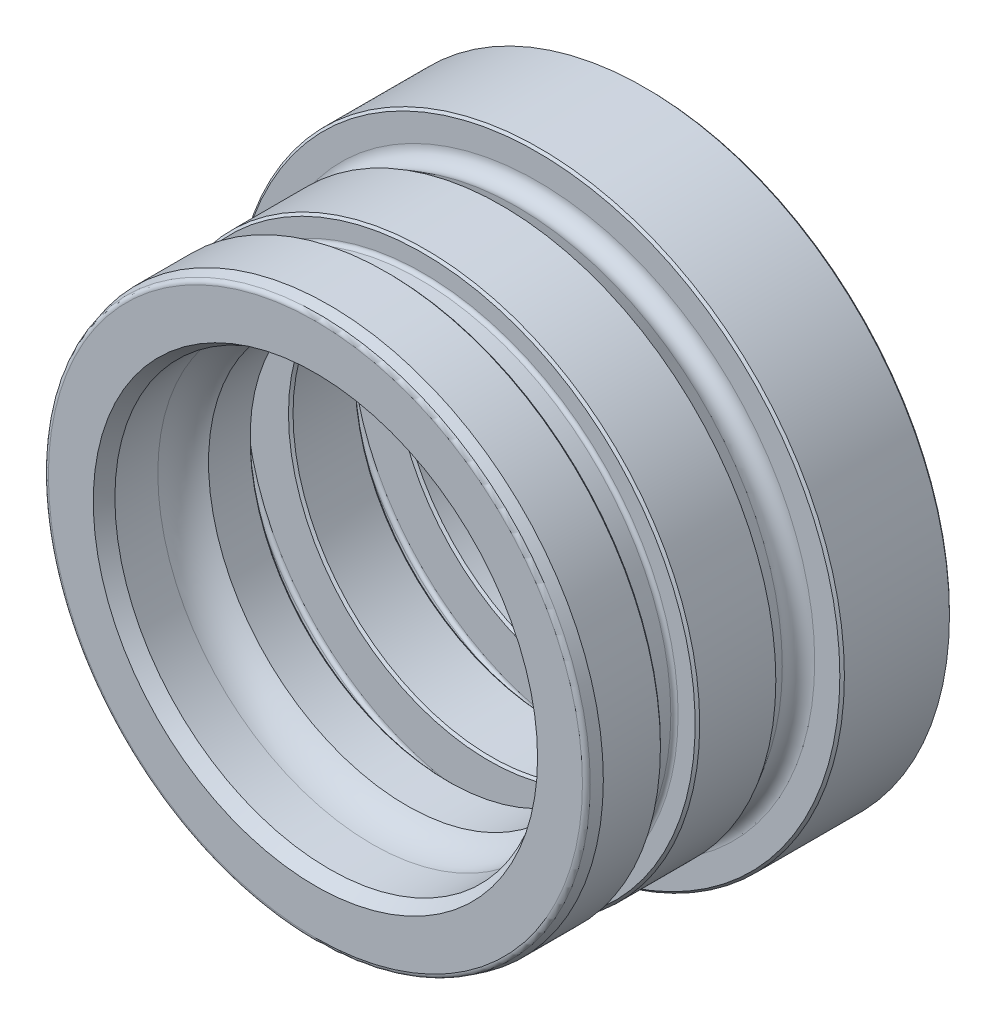
ISO-10303-21;
HEADER;
FILE_DESCRIPTION(('STEP AP214'),'2;1');
FILE_NAME('part.step','',(''),(''),'','','');
FILE_SCHEMA(('AUTOMOTIVE_DESIGN { 1 0 10303 214 1 1 1 1 }'));
ENDSEC;
DATA;
#1=APPLICATION_CONTEXT('core data for automotive mechanical design processes');
#2=APPLICATION_PROTOCOL_DEFINITION('international standard','automotive_design',2000,#1);
#3=PRODUCT_CONTEXT('',#1,'mechanical');
#4=PRODUCT('Part','Part','',(#3));
#5=PRODUCT_RELATED_PRODUCT_CATEGORY('part','',(#4));
#6=PRODUCT_DEFINITION_FORMATION('','',#4);
#7=PRODUCT_DEFINITION_CONTEXT('part definition',#1,'design');
#8=PRODUCT_DEFINITION('design','',#6,#7);
#9=PRODUCT_DEFINITION_SHAPE('','',#8);
#10=(LENGTH_UNIT() NAMED_UNIT(*) SI_UNIT(.MILLI.,.METRE.));
#11=(NAMED_UNIT(*) PLANE_ANGLE_UNIT() SI_UNIT($,.RADIAN.));
#12=(NAMED_UNIT(*) SI_UNIT($,.STERADIAN.) SOLID_ANGLE_UNIT());
#13=UNCERTAINTY_MEASURE_WITH_UNIT(LENGTH_MEASURE(1.E-05),#10,'distance_accuracy_value','');
#14=(GEOMETRIC_REPRESENTATION_CONTEXT(3) GLOBAL_UNCERTAINTY_ASSIGNED_CONTEXT((#13)) GLOBAL_UNIT_ASSIGNED_CONTEXT((#10,
#11,#12)) REPRESENTATION_CONTEXT('',''));
#15=CARTESIAN_POINT('',(0.,0.,0.));
#16=DIRECTION('',(0.,0.,1.));
#17=DIRECTION('',(1.,0.,0.));
#18=AXIS2_PLACEMENT_3D('',#15,#16,#17);
#19=CARTESIAN_POINT('',(0.,0.,-22.8));
#20=DIRECTION('',(0.,0.,1.));
#21=DIRECTION('',(1.,0.,0.));
#22=AXIS2_PLACEMENT_3D('',#19,#20,#21);
#23=TOROIDAL_SURFACE('',#22,30.35,1.5);
#24=CARTESIAN_POINT('',(0.,0.,-22.05));
#25=DIRECTION('',(0.,0.,1.));
#26=DIRECTION('',(1.,0.,0.));
#27=AXIS2_PLACEMENT_3D('',#24,#25,#26);
#28=CIRCLE('',#27,29.0509618943233);
#29=CARTESIAN_POINT('',(29.0509618943233,0.,-22.05));
#30=VERTEX_POINT('',#29);
#31=EDGE_CURVE('E107',#30,#30,#28,.T.);
#32=ORIENTED_EDGE('',*,*,#31,.F.);
#33=EDGE_LOOP('',(#32));
#34=FACE_BOUND('',#33,.T.);
#35=CARTESIAN_POINT('',(0.,0.,-24.3));
#36=DIRECTION('',(0.,0.,1.));
#37=DIRECTION('',(1.,0.,0.));
#38=AXIS2_PLACEMENT_3D('',#35,#36,#37);
#39=CIRCLE('',#38,30.35);
#40=CARTESIAN_POINT('',(30.35,0.,-24.3));
#41=VERTEX_POINT('',#40);
#42=EDGE_CURVE('E207',#41,#41,#39,.T.);
#43=ORIENTED_EDGE('',*,*,#42,.T.);
#44=EDGE_LOOP('',(#43));
#45=FACE_BOUND('',#44,.T.);
#46=ADVANCED_FACE('F41',(#34,#45),#23,.F.);
#47=CARTESIAN_POINT('',(0.,0.,-22.05));
#48=DIRECTION('',(0.,0.,1.));
#49=DIRECTION('',(1.,0.,0.));
#50=AXIS2_PLACEMENT_3D('',#47,#48,#49);
#51=CONICAL_SURFACE('',#50,29.0509618943233,0.5235987755983);
#52=CARTESIAN_POINT('',(0.,0.,-20.3802370205356));
#53=DIRECTION('',(0.,0.,1.));
#54=DIRECTION('',(1.,0.,0.));
#55=AXIS2_PLACEMENT_3D('',#52,#53,#54);
#56=CIRCLE('',#55,30.015);
#57=CARTESIAN_POINT('',(30.015,0.,-20.3802370205356));
#58=VERTEX_POINT('',#57);
#59=EDGE_CURVE('E111',#58,#58,#56,.T.);
#60=ORIENTED_EDGE('',*,*,#59,.F.);
#61=EDGE_LOOP('',(#60));
#62=FACE_BOUND('',#61,.T.);
#63=ORIENTED_EDGE('',*,*,#31,.T.);
#64=EDGE_LOOP('',(#63));
#65=FACE_BOUND('',#64,.T.);
#66=ADVANCED_FACE('F231',(#62,#65),#51,.T.);
#67=CARTESIAN_POINT('',(0.,0.,32.9509546686376));
#68=DIRECTION('',(0.,0.,1.));
#69=DIRECTION('',(1.,0.,0.));
#70=AXIS2_PLACEMENT_3D('',#67,#68,#69);
#71=CYLINDRICAL_SURFACE('',#70,30.015);
#72=CARTESIAN_POINT('',(0.,0.,-12.05));
#73=DIRECTION('',(0.,0.,-1.));
#74=DIRECTION('',(-1.,0.,0.));
#75=AXIS2_PLACEMENT_3D('',#72,#73,#74);
#76=CIRCLE('',#75,30.015);
#77=CARTESIAN_POINT('',(-30.015,0.,-12.05));
#78=VERTEX_POINT('',#77);
#79=EDGE_CURVE('E83',#78,#78,#76,.T.);
#80=ORIENTED_EDGE('',*,*,#79,.T.);
#81=EDGE_LOOP('',(#80));
#82=FACE_BOUND('',#81,.T.);
#83=ORIENTED_EDGE('',*,*,#59,.T.);
#84=EDGE_LOOP('',(#83));
#85=FACE_BOUND('',#84,.T.);
#86=ADVANCED_FACE('F237',(#82,#85),#71,.T.);
#87=CARTESIAN_POINT('',(0.,30.015,-11.8));
#88=DIRECTION('',(0.,0.,-1.));
#89=DIRECTION('',(-1.,0.,0.));
#90=AXIS2_PLACEMENT_3D('',#87,#88,#89);
#91=PLANE('',#90);
#92=CARTESIAN_POINT('',(0.,0.,-11.8));
#93=DIRECTION('',(0.,0.,-1.));
#94=DIRECTION('',(-1.,0.,0.));
#95=AXIS2_PLACEMENT_3D('',#92,#93,#94);
#96=CIRCLE('',#95,29.765);
#97=CARTESIAN_POINT('',(-29.765,0.,-11.8));
#98=VERTEX_POINT('',#97);
#99=EDGE_CURVE('E87',#98,#98,#96,.F.);
#100=ORIENTED_EDGE('',*,*,#99,.T.);
#101=EDGE_LOOP('',(#100));
#102=FACE_BOUND('',#101,.T.);
#103=CARTESIAN_POINT('',(0.,0.,-11.8));
#104=DIRECTION('',(0.,0.,1.));
#105=DIRECTION('',(1.,0.,0.));
#106=AXIS2_PLACEMENT_3D('',#103,#104,#105);
#107=CIRCLE('',#106,27.9);
#108=CARTESIAN_POINT('',(27.9,0.,-11.8));
#109=VERTEX_POINT('',#108);
#110=EDGE_CURVE('E115',#109,#109,#107,.T.);
#111=ORIENTED_EDGE('',*,*,#110,.F.);
#112=EDGE_LOOP('',(#111));
#113=FACE_BOUND('',#112,.T.);
#114=ADVANCED_FACE('F359',(#102,#113),#91,.F.);
#115=CARTESIAN_POINT('',(0.,0.,-11.4));
#116=DIRECTION('',(0.,0.,1.));
#117=DIRECTION('',(1.,0.,0.));
#118=AXIS2_PLACEMENT_3D('',#115,#116,#117);
#119=TOROIDAL_SURFACE('',#118,27.9,0.4);
#120=CARTESIAN_POINT('',(0.,0.,-11.4));
#121=DIRECTION('',(0.,0.,1.));
#122=DIRECTION('',(1.,0.,0.));
#123=AXIS2_PLACEMENT_3D('',#120,#121,#122);
#124=CIRCLE('',#123,27.5);
#125=CARTESIAN_POINT('',(27.5,0.,-11.4));
#126=VERTEX_POINT('',#125);
#127=EDGE_CURVE('E119',#126,#126,#124,.T.);
#128=ORIENTED_EDGE('',*,*,#127,.F.);
#129=EDGE_LOOP('',(#128));
#130=FACE_BOUND('',#129,.T.);
#131=ORIENTED_EDGE('',*,*,#110,.T.);
#132=EDGE_LOOP('',(#131));
#133=FACE_BOUND('',#132,.T.);
#134=ADVANCED_FACE('F355',(#130,#133),#119,.F.);
#135=CARTESIAN_POINT('',(0.,0.,32.9509546686376));
#136=DIRECTION('',(0.,0.,1.));
#137=DIRECTION('',(1.,0.,0.));
#138=AXIS2_PLACEMENT_3D('',#135,#136,#137);
#139=CYLINDRICAL_SURFACE('',#138,27.5);
#140=CARTESIAN_POINT('',(0.,0.,-8.4));
#141=DIRECTION('',(0.,0.,1.));
#142=DIRECTION('',(1.,0.,0.));
#143=AXIS2_PLACEMENT_3D('',#140,#141,#142);
#144=CIRCLE('',#143,27.5);
#145=CARTESIAN_POINT('',(27.5,0.,-8.4));
#146=VERTEX_POINT('',#145);
#147=EDGE_CURVE('E123',#146,#146,#144,.T.);
#148=ORIENTED_EDGE('',*,*,#147,.F.);
#149=EDGE_LOOP('',(#148));
#150=FACE_BOUND('',#149,.T.);
#151=ORIENTED_EDGE('',*,*,#127,.T.);
#152=EDGE_LOOP('',(#151));
#153=FACE_BOUND('',#152,.T.);
#154=ADVANCED_FACE('F351',(#150,#153),#139,.T.);
#155=CARTESIAN_POINT('',(0.,0.,-8.4));
#156=DIRECTION('',(0.,0.,1.));
#157=DIRECTION('',(1.,0.,0.));
#158=AXIS2_PLACEMENT_3D('',#155,#156,#157);
#159=TOROIDAL_SURFACE('',#158,27.9,0.4);
#160=CARTESIAN_POINT('',(0.,0.,-8.));
#161=DIRECTION('',(0.,0.,1.));
#162=DIRECTION('',(1.,0.,0.));
#163=AXIS2_PLACEMENT_3D('',#160,#161,#162);
#164=CIRCLE('',#163,27.9);
#165=CARTESIAN_POINT('',(27.9,0.,-8.));
#166=VERTEX_POINT('',#165);
#167=EDGE_CURVE('E127',#166,#166,#164,.T.);
#168=ORIENTED_EDGE('',*,*,#167,.F.);
#169=EDGE_LOOP('',(#168));
#170=FACE_BOUND('',#169,.T.);
#171=ORIENTED_EDGE('',*,*,#147,.T.);
#172=EDGE_LOOP('',(#171));
#173=FACE_BOUND('',#172,.T.);
#174=ADVANCED_FACE('F347',(#170,#173),#159,.F.);
#175=CARTESIAN_POINT('',(0.,27.9,-8.));
#176=DIRECTION('',(0.,0.,1.));
#177=DIRECTION('',(1.,0.,0.));
#178=AXIS2_PLACEMENT_3D('',#175,#176,#177);
#179=PLANE('',#178);
#180=CARTESIAN_POINT('',(0.,0.,-8.));
#181=DIRECTION('',(0.,0.,1.));
#182=DIRECTION('',(1.,0.,0.));
#183=AXIS2_PLACEMENT_3D('',#180,#181,#182);
#184=CIRCLE('',#183,29.765);
#185=CARTESIAN_POINT('',(29.765,0.,-8.));
#186=VERTEX_POINT('',#185);
#187=EDGE_CURVE('E91',#186,#186,#184,.F.);
#188=ORIENTED_EDGE('',*,*,#187,.T.);
#189=EDGE_LOOP('',(#188));
#190=FACE_BOUND('',#189,.T.);
#191=ORIENTED_EDGE('',*,*,#167,.T.);
#192=EDGE_LOOP('',(#191));
#193=FACE_BOUND('',#192,.T.);
#194=ADVANCED_FACE('F343',(#190,#193),#179,.F.);
#195=CARTESIAN_POINT('',(0.,0.,32.9509546686376));
#196=DIRECTION('',(0.,0.,1.));
#197=DIRECTION('',(1.,0.,0.));
#198=AXIS2_PLACEMENT_3D('',#195,#196,#197);
#199=CYLINDRICAL_SURFACE('',#198,30.015);
#200=CARTESIAN_POINT('',(0.,0.,-7.75000000000001));
#201=DIRECTION('',(0.,0.,1.));
#202=DIRECTION('',(1.,0.,0.));
#203=AXIS2_PLACEMENT_3D('',#200,#201,#202);
#204=CIRCLE('',#203,30.015);
#205=CARTESIAN_POINT('',(30.015,0.,-7.75000000000001));
#206=VERTEX_POINT('',#205);
#207=EDGE_CURVE('E95',#206,#206,#204,.T.);
#208=ORIENTED_EDGE('',*,*,#207,.T.);
#209=EDGE_LOOP('',(#208));
#210=FACE_BOUND('',#209,.T.);
#211=CARTESIAN_POINT('',(0.,0.,-1.5));
#212=DIRECTION('',(0.,0.,1.));
#213=DIRECTION('',(1.,0.,0.));
#214=AXIS2_PLACEMENT_3D('',#211,#212,#213);
#215=CIRCLE('',#214,30.015);
#216=CARTESIAN_POINT('',(30.015,0.,-1.5));
#217=VERTEX_POINT('',#216);
#218=EDGE_CURVE('E131',#217,#217,#215,.T.);
#219=ORIENTED_EDGE('',*,*,#218,.F.);
#220=EDGE_LOOP('',(#219));
#221=FACE_BOUND('',#220,.T.);
#222=ADVANCED_FACE('F339',(#210,#221),#199,.T.);
#223=CARTESIAN_POINT('',(0.,0.,-1.5));
#224=DIRECTION('',(0.,0.,-1.));
#225=DIRECTION('',(-1.,0.,0.));
#226=AXIS2_PLACEMENT_3D('',#223,#224,#225);
#227=CONICAL_SURFACE('',#226,30.015,0.261799387799151);
#228=CARTESIAN_POINT('',(0.,0.,-0.370590477448737));
#229=DIRECTION('',(0.,0.,1.));
#230=DIRECTION('',(1.,0.,0.));
#231=AXIS2_PLACEMENT_3D('',#228,#229,#230);
#232=CIRCLE('',#231,29.7123756305084);
#233=CARTESIAN_POINT('',(29.7123756305084,0.,-0.370590477448737));
#234=VERTEX_POINT('',#233);
#235=EDGE_CURVE('E135',#234,#234,#232,.T.);
#236=ORIENTED_EDGE('',*,*,#235,.F.);
#237=EDGE_LOOP('',(#236));
#238=FACE_BOUND('',#237,.T.);
#239=ORIENTED_EDGE('',*,*,#218,.T.);
#240=EDGE_LOOP('',(#239));
#241=FACE_BOUND('',#240,.T.);
#242=ADVANCED_FACE('F335',(#238,#241),#227,.T.);
#243=CARTESIAN_POINT('',(0.,0.,-0.5));
#244=DIRECTION('',(0.,0.,1.));
#245=DIRECTION('',(1.,0.,0.));
#246=AXIS2_PLACEMENT_3D('',#243,#244,#245);
#247=TOROIDAL_SURFACE('',#246,29.2294127173638,0.499999999999999);
#248=CARTESIAN_POINT('',(0.,0.,0.));
#249=DIRECTION('',(0.,0.,1.));
#250=DIRECTION('',(1.,0.,0.));
#251=AXIS2_PLACEMENT_3D('',#248,#249,#250);
#252=CIRCLE('',#251,29.2294127173638);
#253=CARTESIAN_POINT('',(29.2294127173638,0.,0.));
#254=VERTEX_POINT('',#253);
#255=EDGE_CURVE('E139',#254,#254,#252,.T.);
#256=ORIENTED_EDGE('',*,*,#255,.F.);
#257=EDGE_LOOP('',(#256));
#258=FACE_BOUND('',#257,.T.);
#259=ORIENTED_EDGE('',*,*,#235,.T.);
#260=EDGE_LOOP('',(#259));
#261=FACE_BOUND('',#260,.T.);
#262=ADVANCED_FACE('F331',(#258,#261),#247,.T.);
#263=CARTESIAN_POINT('',(0.,29.2294127173638,0.));
#264=DIRECTION('',(0.,0.,-1.));
#265=DIRECTION('',(-1.,0.,0.));
#266=AXIS2_PLACEMENT_3D('',#263,#264,#265);
#267=PLANE('',#266);
#268=CARTESIAN_POINT('',(0.,0.,0.));
#269=DIRECTION('',(0.,0.,1.));
#270=DIRECTION('',(1.,0.,0.));
#271=AXIS2_PLACEMENT_3D('',#268,#269,#270);
#272=CIRCLE('',#271,24.3160254037844);
#273=CARTESIAN_POINT('',(24.3160254037844,0.,0.));
#274=VERTEX_POINT('',#273);
#275=EDGE_CURVE('E143',#274,#274,#272,.T.);
#276=ORIENTED_EDGE('',*,*,#275,.F.);
#277=EDGE_LOOP('',(#276));
#278=FACE_BOUND('',#277,.T.);
#279=ORIENTED_EDGE('',*,*,#255,.T.);
#280=EDGE_LOOP('',(#279));
#281=FACE_BOUND('',#280,.T.);
#282=ADVANCED_FACE('F327',(#278,#281),#267,.F.);
#283=CARTESIAN_POINT('',(0.,0.,0.));
#284=DIRECTION('',(0.,0.,1.));
#285=DIRECTION('',(1.,0.,0.));
#286=AXIS2_PLACEMENT_3D('',#283,#284,#285);
#287=CONICAL_SURFACE('',#286,24.3160254037844,0.523598775598297);
#288=CARTESIAN_POINT('',(0.,0.,-1.5));
#289=DIRECTION('',(0.,0.,1.));
#290=DIRECTION('',(1.,0.,0.));
#291=AXIS2_PLACEMENT_3D('',#288,#289,#290);
#292=CIRCLE('',#291,23.45);
#293=CARTESIAN_POINT('',(23.45,0.,-1.5));
#294=VERTEX_POINT('',#293);
#295=EDGE_CURVE('E147',#294,#294,#292,.T.);
#296=ORIENTED_EDGE('',*,*,#295,.F.);
#297=EDGE_LOOP('',(#296));
#298=FACE_BOUND('',#297,.T.);
#299=ORIENTED_EDGE('',*,*,#275,.T.);
#300=EDGE_LOOP('',(#299));
#301=FACE_BOUND('',#300,.T.);
#302=ADVANCED_FACE('F323',(#298,#301),#287,.F.);
#303=CARTESIAN_POINT('',(0.,0.,32.9509546686376));
#304=DIRECTION('',(0.,0.,1.));
#305=DIRECTION('',(1.,0.,0.));
#306=AXIS2_PLACEMENT_3D('',#303,#304,#305);
#307=CYLINDRICAL_SURFACE('',#306,23.45);
#308=CARTESIAN_POINT('',(0.,0.,-6.20032896160734));
#309=DIRECTION('',(0.,0.,1.));
#310=DIRECTION('',(1.,0.,0.));
#311=AXIS2_PLACEMENT_3D('',#308,#309,#310);
#312=CIRCLE('',#311,23.45);
#313=CARTESIAN_POINT('',(23.45,0.,-6.20032896160734));
#314=VERTEX_POINT('',#313);
#315=EDGE_CURVE('E151',#314,#314,#312,.T.);
#316=ORIENTED_EDGE('',*,*,#315,.F.);
#317=EDGE_LOOP('',(#316));
#318=FACE_BOUND('',#317,.T.);
#319=ORIENTED_EDGE('',*,*,#295,.T.);
#320=EDGE_LOOP('',(#319));
#321=FACE_BOUND('',#320,.T.);
#322=ADVANCED_FACE('F319',(#318,#321),#307,.F.);
#323=CARTESIAN_POINT('',(0.,0.,-6.20032896160734));
#324=DIRECTION('',(0.,0.,1.));
#325=DIRECTION('',(1.,0.,0.));
#326=AXIS2_PLACEMENT_3D('',#323,#324,#325);
#327=TOROIDAL_SURFACE('',#326,18.45,5.);
#328=CARTESIAN_POINT('',(0.,0.,-10.));
#329=DIRECTION('',(0.,0.,1.));
#330=DIRECTION('',(1.,0.,0.));
#331=AXIS2_PLACEMENT_3D('',#328,#329,#330);
#332=CIRCLE('',#331,21.7);
#333=CARTESIAN_POINT('',(21.7,0.,-10.));
#334=VERTEX_POINT('',#333);
#335=EDGE_CURVE('E155',#334,#334,#332,.T.);
#336=ORIENTED_EDGE('',*,*,#335,.F.);
#337=EDGE_LOOP('',(#336));
#338=FACE_BOUND('',#337,.T.);
#339=ORIENTED_EDGE('',*,*,#315,.T.);
#340=EDGE_LOOP('',(#339));
#341=FACE_BOUND('',#340,.T.);
#342=ADVANCED_FACE('F315',(#338,#341),#327,.F.);
#343=CARTESIAN_POINT('',(0.,0.,32.9509546686376));
#344=DIRECTION('',(0.,0.,1.));
#345=DIRECTION('',(1.,0.,0.));
#346=AXIS2_PLACEMENT_3D('',#343,#344,#345);
#347=CYLINDRICAL_SURFACE('',#346,21.7);
#348=CARTESIAN_POINT('',(0.,0.,-14.55));
#349=DIRECTION('',(0.,0.,1.));
#350=DIRECTION('',(1.,0.,0.));
#351=AXIS2_PLACEMENT_3D('',#348,#349,#350);
#352=CIRCLE('',#351,21.7);
#353=CARTESIAN_POINT('',(21.7,0.,-14.55));
#354=VERTEX_POINT('',#353);
#355=EDGE_CURVE('E61',#354,#354,#352,.F.);
#356=ORIENTED_EDGE('',*,*,#355,.T.);
#357=EDGE_LOOP('',(#356));
#358=FACE_BOUND('',#357,.T.);
#359=ORIENTED_EDGE('',*,*,#335,.T.);
#360=EDGE_LOOP('',(#359));
#361=FACE_BOUND('',#360,.T.);
#362=ADVANCED_FACE('F311',(#358,#361),#347,.F.);
#363=CARTESIAN_POINT('',(0.,21.7,-14.8));
#364=DIRECTION('',(0.,0.,1.));
#365=DIRECTION('',(1.,0.,0.));
#366=AXIS2_PLACEMENT_3D('',#363,#364,#365);
#367=PLANE('',#366);
#368=CARTESIAN_POINT('',(0.,0.,-14.8));
#369=DIRECTION('',(0.,0.,1.));
#370=DIRECTION('',(1.,0.,0.));
#371=AXIS2_PLACEMENT_3D('',#368,#369,#370);
#372=CIRCLE('',#371,21.95);
#373=CARTESIAN_POINT('',(21.95,0.,-14.8));
#374=VERTEX_POINT('',#373);
#375=EDGE_CURVE('E67',#374,#374,#372,.T.);
#376=ORIENTED_EDGE('',*,*,#375,.T.);
#377=EDGE_LOOP('',(#376));
#378=FACE_BOUND('',#377,.T.);
#379=CARTESIAN_POINT('',(0.,0.,-14.8));
#380=DIRECTION('',(0.,0.,1.));
#381=DIRECTION('',(1.,0.,0.));
#382=AXIS2_PLACEMENT_3D('',#379,#380,#381);
#383=CIRCLE('',#382,26.6);
#384=CARTESIAN_POINT('',(26.6,0.,-14.8));
#385=VERTEX_POINT('',#384);
#386=EDGE_CURVE('E159',#385,#385,#383,.T.);
#387=ORIENTED_EDGE('',*,*,#386,.F.);
#388=EDGE_LOOP('',(#387));
#389=FACE_BOUND('',#388,.T.);
#390=ADVANCED_FACE('F307',(#378,#389),#367,.F.);
#391=CARTESIAN_POINT('',(0.,0.,-15.2));
#392=DIRECTION('',(0.,0.,1.));
#393=DIRECTION('',(1.,0.,0.));
#394=AXIS2_PLACEMENT_3D('',#391,#392,#393);
#395=TOROIDAL_SURFACE('',#394,26.6,0.4);
#396=CARTESIAN_POINT('',(0.,0.,-15.2));
#397=DIRECTION('',(0.,0.,1.));
#398=DIRECTION('',(1.,0.,0.));
#399=AXIS2_PLACEMENT_3D('',#396,#397,#398);
#400=CIRCLE('',#399,27.);
#401=CARTESIAN_POINT('',(27.,0.,-15.2));
#402=VERTEX_POINT('',#401);
#403=EDGE_CURVE('E163',#402,#402,#400,.T.);
#404=ORIENTED_EDGE('',*,*,#403,.F.);
#405=EDGE_LOOP('',(#404));
#406=FACE_BOUND('',#405,.T.);
#407=ORIENTED_EDGE('',*,*,#386,.T.);
#408=EDGE_LOOP('',(#407));
#409=FACE_BOUND('',#408,.T.);
#410=ADVANCED_FACE('F303',(#406,#409),#395,.F.);
#411=CARTESIAN_POINT('',(0.,0.,32.9509546686376));
#412=DIRECTION('',(0.,0.,1.));
#413=DIRECTION('',(1.,0.,0.));
#414=AXIS2_PLACEMENT_3D('',#411,#412,#413);
#415=CYLINDRICAL_SURFACE('',#414,27.);
#416=CARTESIAN_POINT('',(0.,0.,-18.6));
#417=DIRECTION('',(0.,0.,1.));
#418=DIRECTION('',(1.,0.,0.));
#419=AXIS2_PLACEMENT_3D('',#416,#417,#418);
#420=CIRCLE('',#419,27.);
#421=CARTESIAN_POINT('',(27.,0.,-18.6));
#422=VERTEX_POINT('',#421);
#423=EDGE_CURVE('E167',#422,#422,#420,.T.);
#424=ORIENTED_EDGE('',*,*,#423,.F.);
#425=EDGE_LOOP('',(#424));
#426=FACE_BOUND('',#425,.T.);
#427=ORIENTED_EDGE('',*,*,#403,.T.);
#428=EDGE_LOOP('',(#427));
#429=FACE_BOUND('',#428,.T.);
#430=ADVANCED_FACE('F299',(#426,#429),#415,.F.);
#431=CARTESIAN_POINT('',(0.,0.,-18.6));
#432=DIRECTION('',(0.,0.,1.));
#433=DIRECTION('',(1.,0.,0.));
#434=AXIS2_PLACEMENT_3D('',#431,#432,#433);
#435=TOROIDAL_SURFACE('',#434,26.6,0.400000000000001);
#436=CARTESIAN_POINT('',(0.,0.,-19.));
#437=DIRECTION('',(0.,0.,1.));
#438=DIRECTION('',(1.,0.,0.));
#439=AXIS2_PLACEMENT_3D('',#436,#437,#438);
#440=CIRCLE('',#439,26.6);
#441=CARTESIAN_POINT('',(26.6,0.,-19.));
#442=VERTEX_POINT('',#441);
#443=EDGE_CURVE('E171',#442,#442,#440,.T.);
#444=ORIENTED_EDGE('',*,*,#443,.F.);
#445=EDGE_LOOP('',(#444));
#446=FACE_BOUND('',#445,.T.);
#447=ORIENTED_EDGE('',*,*,#423,.T.);
#448=EDGE_LOOP('',(#447));
#449=FACE_BOUND('',#448,.T.);
#450=ADVANCED_FACE('F296',(#446,#449),#435,.F.);
#451=CARTESIAN_POINT('',(0.,26.6,-19.));
#452=DIRECTION('',(0.,0.,-1.));
#453=DIRECTION('',(-1.,0.,0.));
#454=AXIS2_PLACEMENT_3D('',#451,#452,#453);
#455=PLANE('',#454);
#456=CARTESIAN_POINT('',(0.,0.,-19.));
#457=DIRECTION('',(0.,0.,-1.));
#458=DIRECTION('',(-1.,0.,0.));
#459=AXIS2_PLACEMENT_3D('',#456,#457,#458);
#460=CIRCLE('',#459,21.95);
#461=CARTESIAN_POINT('',(-21.95,0.,-19.));
#462=VERTEX_POINT('',#461);
#463=EDGE_CURVE('E71',#462,#462,#460,.T.);
#464=ORIENTED_EDGE('',*,*,#463,.T.);
#465=EDGE_LOOP('',(#464));
#466=FACE_BOUND('',#465,.T.);
#467=ORIENTED_EDGE('',*,*,#443,.T.);
#468=EDGE_LOOP('',(#467));
#469=FACE_BOUND('',#468,.T.);
#470=ADVANCED_FACE('F292',(#466,#469),#455,.F.);
#471=CARTESIAN_POINT('',(0.,0.,32.9509546686376));
#472=DIRECTION('',(0.,0.,1.));
#473=DIRECTION('',(1.,0.,0.));
#474=AXIS2_PLACEMENT_3D('',#471,#472,#473);
#475=CYLINDRICAL_SURFACE('',#474,21.7);
#476=CARTESIAN_POINT('',(0.,0.,-19.25));
#477=DIRECTION('',(0.,0.,-1.));
#478=DIRECTION('',(-1.,0.,0.));
#479=AXIS2_PLACEMENT_3D('',#476,#477,#478);
#480=CIRCLE('',#479,21.7);
#481=CARTESIAN_POINT('',(-21.7,0.,-19.25));
#482=VERTEX_POINT('',#481);
#483=EDGE_CURVE('E75',#482,#482,#480,.F.);
#484=ORIENTED_EDGE('',*,*,#483,.T.);
#485=EDGE_LOOP('',(#484));
#486=FACE_BOUND('',#485,.T.);
#487=CARTESIAN_POINT('',(0.,0.,-26.05));
#488=DIRECTION('',(0.,0.,1.));
#489=DIRECTION('',(1.,0.,0.));
#490=AXIS2_PLACEMENT_3D('',#487,#488,#489);
#491=CIRCLE('',#490,21.7);
#492=CARTESIAN_POINT('',(21.7,0.,-26.05));
#493=VERTEX_POINT('',#492);
#494=EDGE_CURVE('E79',#493,#493,#491,.F.);
#495=ORIENTED_EDGE('',*,*,#494,.T.);
#496=EDGE_LOOP('',(#495));
#497=FACE_BOUND('',#496,.T.);
#498=ADVANCED_FACE('F272',(#486,#497),#475,.F.);
#499=CARTESIAN_POINT('',(0.,21.7,-26.3));
#500=DIRECTION('',(0.,0.,1.));
#501=DIRECTION('',(1.,0.,0.));
#502=AXIS2_PLACEMENT_3D('',#499,#500,#501);
#503=PLANE('',#502);
#504=CARTESIAN_POINT('',(0.,0.,-26.3));
#505=DIRECTION('',(0.,0.,1.));
#506=DIRECTION('',(1.,0.,0.));
#507=AXIS2_PLACEMENT_3D('',#504,#505,#506);
#508=CIRCLE('',#507,21.95);
#509=CARTESIAN_POINT('',(21.95,0.,-26.3));
#510=VERTEX_POINT('',#509);
#511=EDGE_CURVE('E55',#510,#510,#508,.T.);
#512=ORIENTED_EDGE('',*,*,#511,.T.);
#513=EDGE_LOOP('',(#512));
#514=FACE_BOUND('',#513,.T.);
#515=CARTESIAN_POINT('',(0.,0.,-26.3));
#516=DIRECTION('',(0.,0.,1.));
#517=DIRECTION('',(1.,0.,0.));
#518=AXIS2_PLACEMENT_3D('',#515,#516,#517);
#519=CIRCLE('',#518,26.6);
#520=CARTESIAN_POINT('',(26.6,0.,-26.3));
#521=VERTEX_POINT('',#520);
#522=EDGE_CURVE('E175',#521,#521,#519,.T.);
#523=ORIENTED_EDGE('',*,*,#522,.F.);
#524=EDGE_LOOP('',(#523));
#525=FACE_BOUND('',#524,.T.);
#526=ADVANCED_FACE('F268',(#514,#525),#503,.F.);
#527=CARTESIAN_POINT('',(0.,0.,-26.7));
#528=DIRECTION('',(0.,0.,1.));
#529=DIRECTION('',(1.,0.,0.));
#530=AXIS2_PLACEMENT_3D('',#527,#528,#529);
#531=TOROIDAL_SURFACE('',#530,26.6,0.400000000000001);
#532=CARTESIAN_POINT('',(0.,0.,-26.7));
#533=DIRECTION('',(0.,0.,1.));
#534=DIRECTION('',(1.,0.,0.));
#535=AXIS2_PLACEMENT_3D('',#532,#533,#534);
#536=CIRCLE('',#535,27.);
#537=CARTESIAN_POINT('',(27.,0.,-26.7));
#538=VERTEX_POINT('',#537);
#539=EDGE_CURVE('E179',#538,#538,#536,.T.);
#540=ORIENTED_EDGE('',*,*,#539,.F.);
#541=EDGE_LOOP('',(#540));
#542=FACE_BOUND('',#541,.T.);
#543=ORIENTED_EDGE('',*,*,#522,.T.);
#544=EDGE_LOOP('',(#543));
#545=FACE_BOUND('',#544,.T.);
#546=ADVANCED_FACE('F271',(#542,#545),#531,.F.);
#547=CARTESIAN_POINT('',(0.,0.,32.9509546686376));
#548=DIRECTION('',(0.,0.,1.));
#549=DIRECTION('',(1.,0.,0.));
#550=AXIS2_PLACEMENT_3D('',#547,#548,#549);
#551=CYLINDRICAL_SURFACE('',#550,27.);
#552=CARTESIAN_POINT('',(0.,0.,-30.1));
#553=DIRECTION('',(0.,0.,1.));
#554=DIRECTION('',(1.,0.,0.));
#555=AXIS2_PLACEMENT_3D('',#552,#553,#554);
#556=CIRCLE('',#555,27.);
#557=CARTESIAN_POINT('',(27.,0.,-30.1));
#558=VERTEX_POINT('',#557);
#559=EDGE_CURVE('E183',#558,#558,#556,.T.);
#560=ORIENTED_EDGE('',*,*,#559,.F.);
#561=EDGE_LOOP('',(#560));
#562=FACE_BOUND('',#561,.T.);
#563=ORIENTED_EDGE('',*,*,#539,.T.);
#564=EDGE_LOOP('',(#563));
#565=FACE_BOUND('',#564,.T.);
#566=ADVANCED_FACE('F277',(#562,#565),#551,.F.);
#567=CARTESIAN_POINT('',(0.,0.,-30.1));
#568=DIRECTION('',(0.,0.,1.));
#569=DIRECTION('',(1.,0.,0.));
#570=AXIS2_PLACEMENT_3D('',#567,#568,#569);
#571=TOROIDAL_SURFACE('',#570,26.6,0.400000000000001);
#572=CARTESIAN_POINT('',(0.,0.,-30.5));
#573=DIRECTION('',(0.,0.,1.));
#574=DIRECTION('',(1.,0.,0.));
#575=AXIS2_PLACEMENT_3D('',#572,#573,#574);
#576=CIRCLE('',#575,26.6);
#577=CARTESIAN_POINT('',(26.6,0.,-30.5));
#578=VERTEX_POINT('',#577);
#579=EDGE_CURVE('E187',#578,#578,#576,.T.);
#580=ORIENTED_EDGE('',*,*,#579,.F.);
#581=EDGE_LOOP('',(#580));
#582=FACE_BOUND('',#581,.T.);
#583=ORIENTED_EDGE('',*,*,#559,.T.);
#584=EDGE_LOOP('',(#583));
#585=FACE_BOUND('',#584,.T.);
#586=ADVANCED_FACE('F284',(#582,#585),#571,.F.);
#587=CARTESIAN_POINT('',(0.,26.6,-30.5));
#588=DIRECTION('',(0.,0.,-1.));
#589=DIRECTION('',(-1.,0.,0.));
#590=AXIS2_PLACEMENT_3D('',#587,#588,#589);
#591=PLANE('',#590);
#592=CARTESIAN_POINT('',(0.,0.,-30.5));
#593=DIRECTION('',(0.,0.,-1.));
#594=DIRECTION('',(-1.,0.,0.));
#595=AXIS2_PLACEMENT_3D('',#592,#593,#594);
#596=CIRCLE('',#595,21.95);
#597=CARTESIAN_POINT('',(-21.95,0.,-30.5));
#598=VERTEX_POINT('',#597);
#599=EDGE_CURVE('E10',#598,#598,#596,.T.);
#600=ORIENTED_EDGE('',*,*,#599,.T.);
#601=EDGE_LOOP('',(#600));
#602=FACE_BOUND('',#601,.T.);
#603=ORIENTED_EDGE('',*,*,#579,.T.);
#604=EDGE_LOOP('',(#603));
#605=FACE_BOUND('',#604,.T.);
#606=ADVANCED_FACE('F431',(#602,#605),#591,.F.);
#607=CARTESIAN_POINT('',(0.,0.,32.9509546686376));
#608=DIRECTION('',(0.,0.,1.));
#609=DIRECTION('',(1.,0.,0.));
#610=AXIS2_PLACEMENT_3D('',#607,#608,#609);
#611=CYLINDRICAL_SURFACE('',#610,21.7);
#612=CARTESIAN_POINT('',(0.,0.,-30.75));
#613=DIRECTION('',(0.,0.,-1.));
#614=DIRECTION('',(-1.,0.,0.));
#615=AXIS2_PLACEMENT_3D('',#612,#613,#614);
#616=CIRCLE('',#615,21.7);
#617=CARTESIAN_POINT('',(-21.7,0.,-30.75));
#618=VERTEX_POINT('',#617);
#619=EDGE_CURVE('E49',#618,#618,#616,.F.);
#620=ORIENTED_EDGE('',*,*,#619,.T.);
#621=EDGE_LOOP('',(#620));
#622=FACE_BOUND('',#621,.T.);
#623=CARTESIAN_POINT('',(0.,0.,-35.8));
#624=DIRECTION('',(0.,0.,1.));
#625=DIRECTION('',(1.,0.,0.));
#626=AXIS2_PLACEMENT_3D('',#623,#624,#625);
#627=CIRCLE('',#626,21.7);
#628=CARTESIAN_POINT('',(21.7,0.,-35.8));
#629=VERTEX_POINT('',#628);
#630=EDGE_CURVE('E191',#629,#629,#627,.T.);
#631=ORIENTED_EDGE('',*,*,#630,.F.);
#632=EDGE_LOOP('',(#631));
#633=FACE_BOUND('',#632,.T.);
#634=ADVANCED_FACE('F435',(#622,#633),#611,.F.);
#635=CARTESIAN_POINT('',(0.,0.,-35.8));
#636=DIRECTION('',(0.,0.,-1.));
#637=DIRECTION('',(-1.,0.,0.));
#638=AXIS2_PLACEMENT_3D('',#635,#636,#637);
#639=CONICAL_SURFACE('',#638,21.7,0.785398163397445);
#640=CARTESIAN_POINT('',(0.,0.,-36.3));
#641=DIRECTION('',(0.,0.,1.));
#642=DIRECTION('',(1.,0.,0.));
#643=AXIS2_PLACEMENT_3D('',#640,#641,#642);
#644=CIRCLE('',#643,22.2);
#645=CARTESIAN_POINT('',(22.2,0.,-36.3));
#646=VERTEX_POINT('',#645);
#647=EDGE_CURVE('E195',#646,#646,#644,.T.);
#648=ORIENTED_EDGE('',*,*,#647,.F.);
#649=EDGE_LOOP('',(#648));
#650=FACE_BOUND('',#649,.T.);
#651=ORIENTED_EDGE('',*,*,#630,.T.);
#652=EDGE_LOOP('',(#651));
#653=FACE_BOUND('',#652,.T.);
#654=ADVANCED_FACE('F443',(#650,#653),#639,.F.);
#655=CARTESIAN_POINT('',(0.,22.2,-36.3));
#656=DIRECTION('',(0.,0.,1.));
#657=DIRECTION('',(1.,0.,0.));
#658=AXIS2_PLACEMENT_3D('',#655,#656,#657);
#659=PLANE('',#658);
#660=CARTESIAN_POINT('',(0.,0.,-36.3));
#661=DIRECTION('',(0.,0.,1.));
#662=DIRECTION('',(1.,0.,0.));
#663=AXIS2_PLACEMENT_3D('',#660,#661,#662);
#664=CIRCLE('',#663,33.1);
#665=CARTESIAN_POINT('',(33.1,0.,-36.3));
#666=VERTEX_POINT('',#665);
#667=EDGE_CURVE('E199',#666,#666,#664,.T.);
#668=ORIENTED_EDGE('',*,*,#667,.F.);
#669=EDGE_LOOP('',(#668));
#670=FACE_BOUND('',#669,.T.);
#671=ORIENTED_EDGE('',*,*,#647,.T.);
#672=EDGE_LOOP('',(#671));
#673=FACE_BOUND('',#672,.T.);
#674=ADVANCED_FACE('F503',(#670,#673),#659,.F.);
#675=CARTESIAN_POINT('',(0.,0.,-36.3));
#676=DIRECTION('',(0.,0.,1.));
#677=DIRECTION('',(1.,0.,0.));
#678=AXIS2_PLACEMENT_3D('',#675,#676,#677);
#679=CONICAL_SURFACE('',#678,33.1,0.785398163397448);
#680=CARTESIAN_POINT('',(0.,0.,-36.05));
#681=DIRECTION('',(0.,0.,1.));
#682=DIRECTION('',(1.,0.,0.));
#683=AXIS2_PLACEMENT_3D('',#680,#681,#682);
#684=CIRCLE('',#683,33.35);
#685=CARTESIAN_POINT('',(33.35,0.,-36.05));
#686=VERTEX_POINT('',#685);
#687=EDGE_CURVE('E203',#686,#686,#684,.T.);
#688=ORIENTED_EDGE('',*,*,#687,.F.);
#689=EDGE_LOOP('',(#688));
#690=FACE_BOUND('',#689,.T.);
#691=ORIENTED_EDGE('',*,*,#667,.T.);
#692=EDGE_LOOP('',(#691));
#693=FACE_BOUND('',#692,.T.);
#694=ADVANCED_FACE('F227',(#690,#693),#679,.T.);
#695=CARTESIAN_POINT('',(0.,0.,32.9509546686376));
#696=DIRECTION('',(0.,0.,1.));
#697=DIRECTION('',(1.,0.,0.));
#698=AXIS2_PLACEMENT_3D('',#695,#696,#697);
#699=CYLINDRICAL_SURFACE('',#698,33.35);
#700=CARTESIAN_POINT('',(0.,0.,-24.55));
#701=DIRECTION('',(0.,0.,-1.));
#702=DIRECTION('',(-1.,0.,0.));
#703=AXIS2_PLACEMENT_3D('',#700,#701,#702);
#704=CIRCLE('',#703,33.35);
#705=CARTESIAN_POINT('',(-33.35,0.,-24.55));
#706=VERTEX_POINT('',#705);
#707=EDGE_CURVE('E99',#706,#706,#704,.T.);
#708=ORIENTED_EDGE('',*,*,#707,.T.);
#709=EDGE_LOOP('',(#708));
#710=FACE_BOUND('',#709,.T.);
#711=ORIENTED_EDGE('',*,*,#687,.T.);
#712=EDGE_LOOP('',(#711));
#713=FACE_BOUND('',#712,.T.);
#714=ADVANCED_FACE('F217',(#710,#713),#699,.T.);
#715=CARTESIAN_POINT('',(0.,33.35,-24.3));
#716=DIRECTION('',(0.,0.,-1.));
#717=DIRECTION('',(-1.,0.,0.));
#718=AXIS2_PLACEMENT_3D('',#715,#716,#717);
#719=PLANE('',#718);
#720=CARTESIAN_POINT('',(0.,0.,-24.3));
#721=DIRECTION('',(0.,0.,-1.));
#722=DIRECTION('',(-1.,0.,0.));
#723=AXIS2_PLACEMENT_3D('',#720,#721,#722);
#724=CIRCLE('',#723,33.1);
#725=CARTESIAN_POINT('',(-33.1,0.,-24.3));
#726=VERTEX_POINT('',#725);
#727=EDGE_CURVE('E103',#726,#726,#724,.F.);
#728=ORIENTED_EDGE('',*,*,#727,.T.);
#729=EDGE_LOOP('',(#728));
#730=FACE_BOUND('',#729,.T.);
#731=ORIENTED_EDGE('',*,*,#42,.F.);
#732=EDGE_LOOP('',(#731));
#733=FACE_BOUND('',#732,.T.);
#734=ADVANCED_FACE('F214',(#730,#733),#719,.F.);
#735=CARTESIAN_POINT('',(0.,0.,-24.3));
#736=DIRECTION('',(0.,0.,-1.));
#737=DIRECTION('',(-1.,0.,0.));
#738=AXIS2_PLACEMENT_3D('',#735,#736,#737);
#739=CONICAL_SURFACE('',#738,33.1,0.785398163397476);
#740=ORIENTED_EDGE('',*,*,#707,.F.);
#741=EDGE_LOOP('',(#740));
#742=FACE_BOUND('',#741,.T.);
#743=ORIENTED_EDGE('',*,*,#727,.F.);
#744=EDGE_LOOP('',(#743));
#745=FACE_BOUND('',#744,.T.);
#746=ADVANCED_FACE('F216',(#742,#745),#739,.T.);
#747=CARTESIAN_POINT('',(0.,0.,-7.75000000000001));
#748=DIRECTION('',(0.,0.,1.));
#749=DIRECTION('',(1.,0.,0.));
#750=AXIS2_PLACEMENT_3D('',#747,#748,#749);
#751=CONICAL_SURFACE('',#750,30.015,0.785398163397462);
#752=ORIENTED_EDGE('',*,*,#187,.F.);
#753=EDGE_LOOP('',(#752));
#754=FACE_BOUND('',#753,.T.);
#755=ORIENTED_EDGE('',*,*,#207,.F.);
#756=EDGE_LOOP('',(#755));
#757=FACE_BOUND('',#756,.T.);
#758=ADVANCED_FACE('F224',(#754,#757),#751,.T.);
#759=CARTESIAN_POINT('',(0.,0.,-11.8));
#760=DIRECTION('',(0.,0.,-1.));
#761=DIRECTION('',(-1.,0.,0.));
#762=AXIS2_PLACEMENT_3D('',#759,#760,#761);
#763=CONICAL_SURFACE('',#762,29.765,0.785398163397435);
#764=ORIENTED_EDGE('',*,*,#79,.F.);
#765=EDGE_LOOP('',(#764));
#766=FACE_BOUND('',#765,.T.);
#767=ORIENTED_EDGE('',*,*,#99,.F.);
#768=EDGE_LOOP('',(#767));
#769=FACE_BOUND('',#768,.T.);
#770=ADVANCED_FACE('F245',(#766,#769),#763,.T.);
#771=CARTESIAN_POINT('',(0.,0.,-19.25));
#772=DIRECTION('',(0.,0.,1.));
#773=DIRECTION('',(1.,0.,0.));
#774=AXIS2_PLACEMENT_3D('',#771,#772,#773);
#775=CONICAL_SURFACE('',#774,21.7,0.785398163397441);
#776=ORIENTED_EDGE('',*,*,#463,.F.);
#777=EDGE_LOOP('',(#776));
#778=FACE_BOUND('',#777,.T.);
#779=ORIENTED_EDGE('',*,*,#483,.F.);
#780=EDGE_LOOP('',(#779));
#781=FACE_BOUND('',#780,.T.);
#782=ADVANCED_FACE('F249',(#778,#781),#775,.F.);
#783=CARTESIAN_POINT('',(0.,0.,-14.8));
#784=DIRECTION('',(0.,0.,-1.));
#785=DIRECTION('',(-1.,0.,0.));
#786=AXIS2_PLACEMENT_3D('',#783,#784,#785);
#787=CONICAL_SURFACE('',#786,21.95,0.785398163397441);
#788=ORIENTED_EDGE('',*,*,#355,.F.);
#789=EDGE_LOOP('',(#788));
#790=FACE_BOUND('',#789,.T.);
#791=ORIENTED_EDGE('',*,*,#375,.F.);
#792=EDGE_LOOP('',(#791));
#793=FACE_BOUND('',#792,.T.);
#794=ADVANCED_FACE('F253',(#790,#793),#787,.F.);
#795=CARTESIAN_POINT('',(0.,0.,-26.3));
#796=DIRECTION('',(0.,0.,-1.));
#797=DIRECTION('',(-1.,0.,0.));
#798=AXIS2_PLACEMENT_3D('',#795,#796,#797);
#799=CONICAL_SURFACE('',#798,21.95,0.785398163397455);
#800=ORIENTED_EDGE('',*,*,#494,.F.);
#801=EDGE_LOOP('',(#800));
#802=FACE_BOUND('',#801,.T.);
#803=ORIENTED_EDGE('',*,*,#511,.F.);
#804=EDGE_LOOP('',(#803));
#805=FACE_BOUND('',#804,.T.);
#806=ADVANCED_FACE('F256',(#802,#805),#799,.F.);
#807=CARTESIAN_POINT('',(0.,0.,-30.75));
#808=DIRECTION('',(0.,0.,1.));
#809=DIRECTION('',(1.,0.,0.));
#810=AXIS2_PLACEMENT_3D('',#807,#808,#809);
#811=CONICAL_SURFACE('',#810,21.7,0.785398163397441);
#812=ORIENTED_EDGE('',*,*,#599,.F.);
#813=EDGE_LOOP('',(#812));
#814=FACE_BOUND('',#813,.T.);
#815=ORIENTED_EDGE('',*,*,#619,.F.);
#816=EDGE_LOOP('',(#815));
#817=FACE_BOUND('',#816,.T.);
#818=ADVANCED_FACE('F43',(#814,#817),#811,.F.);
#819=CLOSED_SHELL('',(#46,#66,#86,#114,#134,#154,#174,#194,#222,#242,#262,#282,#302,#322,#342,
#362,#390,#410,#430,#450,#470,#498,#526,#546,#566,#586,#606,#634,#654,#674,#694,#714,#734,#746,
#758,#770,#782,#794,#806,#818));
#820=MANIFOLD_SOLID_BREP('B2',#819);
#821=ADVANCED_BREP_SHAPE_REPRESENTATION('',(#18,#820),#14);
#822=SHAPE_DEFINITION_REPRESENTATION(#9,#821);
ENDSEC;
END-ISO-10303-21;
